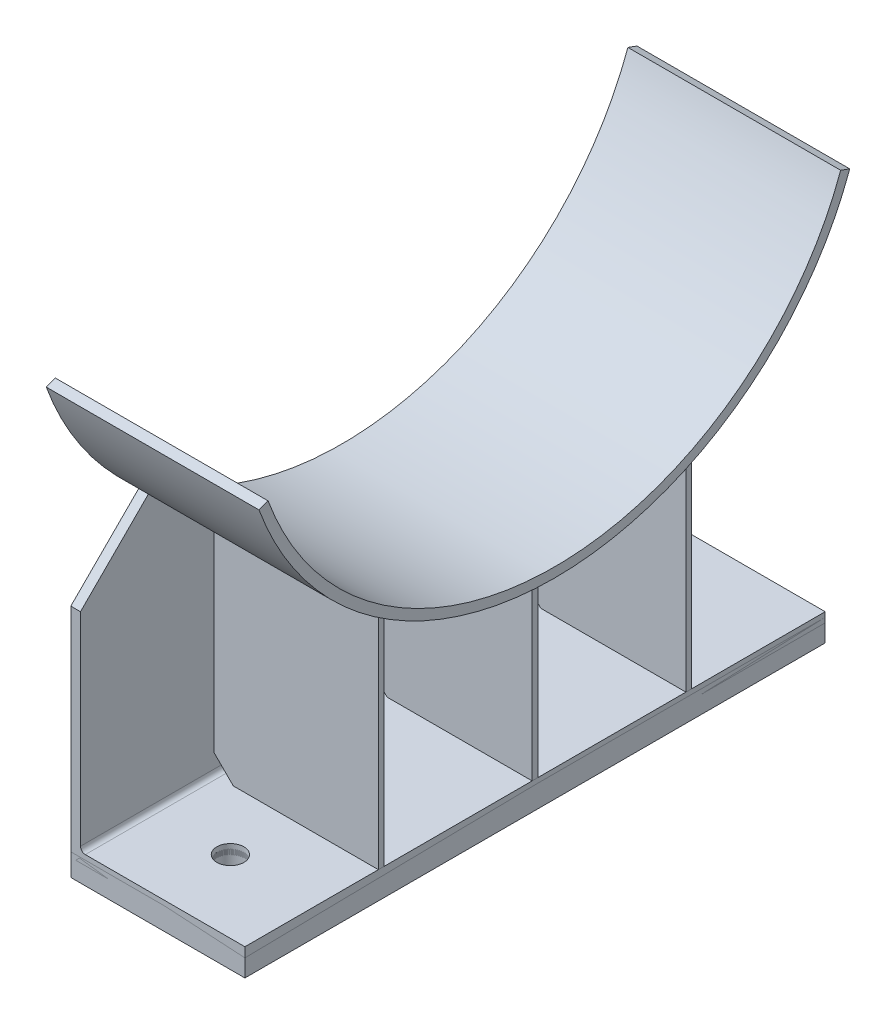
ISO-10303-21;
HEADER;
FILE_DESCRIPTION(('STEP AP214'),'2;1');
FILE_NAME('part.step','',(''),(''),'','','');
FILE_SCHEMA(('AUTOMOTIVE_DESIGN { 1 0 10303 214 1 1 1 1 }'));
ENDSEC;
DATA;
#1=APPLICATION_CONTEXT('core data for automotive mechanical design processes');
#2=APPLICATION_PROTOCOL_DEFINITION('international standard','automotive_design',2000,#1);
#3=PRODUCT_CONTEXT('',#1,'mechanical');
#4=PRODUCT('Part','Part','',(#3));
#5=PRODUCT_RELATED_PRODUCT_CATEGORY('part','',(#4));
#6=PRODUCT_DEFINITION_FORMATION('','',#4);
#7=PRODUCT_DEFINITION_CONTEXT('part definition',#1,'design');
#8=PRODUCT_DEFINITION('design','',#6,#7);
#9=PRODUCT_DEFINITION_SHAPE('','',#8);
#10=(LENGTH_UNIT() NAMED_UNIT(*) SI_UNIT(.MILLI.,.METRE.));
#11=(NAMED_UNIT(*) PLANE_ANGLE_UNIT() SI_UNIT($,.RADIAN.));
#12=(NAMED_UNIT(*) SI_UNIT($,.STERADIAN.) SOLID_ANGLE_UNIT());
#13=UNCERTAINTY_MEASURE_WITH_UNIT(LENGTH_MEASURE(1.E-05),#10,'distance_accuracy_value','');
#14=(GEOMETRIC_REPRESENTATION_CONTEXT(3) GLOBAL_UNCERTAINTY_ASSIGNED_CONTEXT((#13)) GLOBAL_UNIT_ASSIGNED_CONTEXT((#10,
#11,#12)) REPRESENTATION_CONTEXT('',''));
#15=CARTESIAN_POINT('',(0.,0.,0.));
#16=DIRECTION('',(0.,0.,1.));
#17=DIRECTION('',(1.,0.,0.));
#18=AXIS2_PLACEMENT_3D('',#15,#16,#17);
#19=CARTESIAN_POINT('',(-90.,4.99999999999999,300.));
#20=DIRECTION('',(-1.,0.,0.));
#21=DIRECTION('',(0.,-1.,0.));
#22=AXIS2_PLACEMENT_3D('',#19,#20,#21);
#23=PLANE('',#22);
#24=DIRECTION('',(0.,-1.,0.));
#25=VECTOR('',#24,1.);
#26=CARTESIAN_POINT('',(-90.,4.99999999999999,-300.));
#27=LINE('',#26,#25);
#28=CARTESIAN_POINT('',(-90.,4.99999999999999,-300.));
#29=VERTEX_POINT('',#28);
#30=CARTESIAN_POINT('',(-90.,-18.,-300.));
#31=VERTEX_POINT('',#30);
#32=EDGE_CURVE('P0_E35',#29,#31,#27,.T.);
#33=ORIENTED_EDGE('',*,*,#32,.T.);
#34=DIRECTION('',(0.,0.,-1.));
#35=VECTOR('',#34,1.);
#36=CARTESIAN_POINT('',(-90.,-18.,300.));
#37=LINE('',#36,#35);
#38=CARTESIAN_POINT('',(-90.,-18.,300.));
#39=VERTEX_POINT('',#38);
#40=EDGE_CURVE('P0_E72',#39,#31,#37,.T.);
#41=ORIENTED_EDGE('',*,*,#40,.F.);
#42=DIRECTION('',(0.,-1.,0.));
#43=VECTOR('',#42,1.);
#44=CARTESIAN_POINT('',(-90.,4.99999999999999,300.));
#45=LINE('',#44,#43);
#46=CARTESIAN_POINT('',(-90.,4.99999999999999,300.));
#47=VERTEX_POINT('',#46);
#48=EDGE_CURVE('P0_E11',#47,#39,#45,.T.);
#49=ORIENTED_EDGE('',*,*,#48,.F.);
#50=DIRECTION('',(0.,0.,-1.));
#51=VECTOR('',#50,1.);
#52=CARTESIAN_POINT('',(-90.,4.99999999999999,300.));
#53=LINE('',#52,#51);
#54=EDGE_CURVE('P0_E73',#47,#29,#53,.T.);
#55=ORIENTED_EDGE('',*,*,#54,.T.);
#56=EDGE_LOOP('',(#33,#41,#49,#55));
#57=FACE_BOUND('',#56,.T.);
#58=ADVANCED_FACE('P0_F32',(#57),#23,.T.);
#59=CARTESIAN_POINT('',(90.,5.00000000000001,300.));
#60=DIRECTION('',(0.,0.,1.));
#61=DIRECTION('',(1.,0.,0.));
#62=AXIS2_PLACEMENT_3D('',#59,#60,#61);
#63=PLANE('',#62);
#64=ORIENTED_EDGE('',*,*,#48,.T.);
#65=DIRECTION('',(-1.,0.,0.));
#66=VECTOR('',#65,1.);
#67=CARTESIAN_POINT('',(90.,-18.,300.));
#68=LINE('',#67,#66);
#69=CARTESIAN_POINT('',(90.,-18.,300.));
#70=VERTEX_POINT('',#69);
#71=EDGE_CURVE('P0_E89',#70,#39,#68,.T.);
#72=ORIENTED_EDGE('',*,*,#71,.F.);
#73=DIRECTION('',(0.,-1.,0.));
#74=VECTOR('',#73,1.);
#75=CARTESIAN_POINT('',(90.,5.00000000000001,300.));
#76=LINE('',#75,#74);
#77=CARTESIAN_POINT('',(90.,5.00000000000001,300.));
#78=VERTEX_POINT('',#77);
#79=EDGE_CURVE('P0_E40',#78,#70,#76,.T.);
#80=ORIENTED_EDGE('',*,*,#79,.F.);
#81=DIRECTION('',(-1.,0.,0.));
#82=VECTOR('',#81,1.);
#83=CARTESIAN_POINT('',(90.,5.00000000000001,300.));
#84=LINE('',#83,#82);
#85=EDGE_CURVE('P0_E78',#78,#47,#84,.T.);
#86=ORIENTED_EDGE('',*,*,#85,.T.);
#87=EDGE_LOOP('',(#64,#72,#80,#86));
#88=FACE_BOUND('',#87,.T.);
#89=ADVANCED_FACE('P0_F109',(#88),#63,.T.);
#90=CARTESIAN_POINT('',(90.,5.00000000000001,300.));
#91=DIRECTION('',(1.,0.,0.));
#92=DIRECTION('',(0.,1.,0.));
#93=AXIS2_PLACEMENT_3D('',#90,#91,#92);
#94=PLANE('',#93);
#95=ORIENTED_EDGE('',*,*,#79,.T.);
#96=DIRECTION('',(0.,0.,1.));
#97=VECTOR('',#96,1.);
#98=CARTESIAN_POINT('',(90.,-18.,300.));
#99=LINE('',#98,#97);
#100=CARTESIAN_POINT('',(90.,-18.,-300.));
#101=VERTEX_POINT('',#100);
#102=EDGE_CURVE('P0_E85',#101,#70,#99,.T.);
#103=ORIENTED_EDGE('',*,*,#102,.F.);
#104=DIRECTION('',(0.,-1.,0.));
#105=VECTOR('',#104,1.);
#106=CARTESIAN_POINT('',(90.,5.00000000000001,-300.));
#107=LINE('',#106,#105);
#108=CARTESIAN_POINT('',(90.,5.00000000000001,-300.));
#109=VERTEX_POINT('',#108);
#110=EDGE_CURVE('P0_E77',#109,#101,#107,.T.);
#111=ORIENTED_EDGE('',*,*,#110,.F.);
#112=DIRECTION('',(0.,0.,1.));
#113=VECTOR('',#112,1.);
#114=CARTESIAN_POINT('',(90.,5.00000000000001,300.));
#115=LINE('',#114,#113);
#116=EDGE_CURVE('P0_E102',#109,#78,#115,.T.);
#117=ORIENTED_EDGE('',*,*,#116,.T.);
#118=EDGE_LOOP('',(#95,#103,#111,#117));
#119=FACE_BOUND('',#118,.T.);
#120=ADVANCED_FACE('P0_F106',(#119),#94,.T.);
#121=CARTESIAN_POINT('',(90.,5.00000000000001,-300.));
#122=DIRECTION('',(0.,0.,-1.));
#123=DIRECTION('',(-1.,0.,0.));
#124=AXIS2_PLACEMENT_3D('',#121,#122,#123);
#125=PLANE('',#124);
#126=ORIENTED_EDGE('',*,*,#110,.T.);
#127=DIRECTION('',(1.,0.,0.));
#128=VECTOR('',#127,1.);
#129=CARTESIAN_POINT('',(90.,-18.,-300.));
#130=LINE('',#129,#128);
#131=EDGE_CURVE('P0_E80',#31,#101,#130,.T.);
#132=ORIENTED_EDGE('',*,*,#131,.F.);
#133=ORIENTED_EDGE('',*,*,#32,.F.);
#134=DIRECTION('',(1.,0.,0.));
#135=VECTOR('',#134,1.);
#136=CARTESIAN_POINT('',(90.,5.00000000000001,-300.));
#137=LINE('',#136,#135);
#138=EDGE_CURVE('P0_E100',#29,#109,#137,.T.);
#139=ORIENTED_EDGE('',*,*,#138,.T.);
#140=EDGE_LOOP('',(#126,#132,#133,#139));
#141=FACE_BOUND('',#140,.T.);
#142=ADVANCED_FACE('P0_F81',(#141),#125,.T.);
#143=CARTESIAN_POINT('',(0.,5.,0.));
#144=DIRECTION('',(0.,1.,0.));
#145=DIRECTION('',(-1.,0.,0.));
#146=AXIS2_PLACEMENT_3D('',#143,#144,#145);
#147=PLANE('',#146);
#148=CARTESIAN_POINT('',(0.,5.,225.));
#149=DIRECTION('',(0.,1.,0.));
#150=DIRECTION('',(-1.,0.,0.));
#151=AXIS2_PLACEMENT_3D('',#148,#149,#150);
#152=CIRCLE('',#151,14.);
#153=CARTESIAN_POINT('',(-14.,5.,225.));
#154=VERTEX_POINT('',#153);
#155=EDGE_CURVE('P0_E177',#154,#154,#152,.T.);
#156=ORIENTED_EDGE('',*,*,#155,.F.);
#157=EDGE_LOOP('',(#156));
#158=FACE_BOUND('',#157,.T.);
#159=CARTESIAN_POINT('',(0.,5.,-225.));
#160=DIRECTION('',(0.,1.,0.));
#161=DIRECTION('',(-1.,0.,0.));
#162=AXIS2_PLACEMENT_3D('',#159,#160,#161);
#163=CIRCLE('',#162,14.);
#164=CARTESIAN_POINT('',(-14.,5.,-225.));
#165=VERTEX_POINT('',#164);
#166=EDGE_CURVE('P0_E93',#165,#165,#163,.T.);
#167=ORIENTED_EDGE('',*,*,#166,.F.);
#168=EDGE_LOOP('',(#167));
#169=FACE_BOUND('',#168,.T.);
#170=ORIENTED_EDGE('',*,*,#54,.F.);
#171=ORIENTED_EDGE('',*,*,#85,.F.);
#172=ORIENTED_EDGE('',*,*,#116,.F.);
#173=ORIENTED_EDGE('',*,*,#138,.F.);
#174=EDGE_LOOP('',(#170,#171,#172,#173));
#175=FACE_BOUND('',#174,.T.);
#176=ADVANCED_FACE('P0_F111',(#158,#169,#175),#147,.T.);
#177=CARTESIAN_POINT('',(0.,-18.,0.));
#178=DIRECTION('',(0.,1.,0.));
#179=DIRECTION('',(-1.,0.,0.));
#180=AXIS2_PLACEMENT_3D('',#177,#178,#179);
#181=PLANE('',#180);
#182=CARTESIAN_POINT('',(0.,-18.,225.));
#183=DIRECTION('',(0.,1.,0.));
#184=DIRECTION('',(-1.,0.,0.));
#185=AXIS2_PLACEMENT_3D('',#182,#183,#184);
#186=CIRCLE('',#185,14.);
#187=CARTESIAN_POINT('',(-14.,-18.,225.));
#188=VERTEX_POINT('',#187);
#189=EDGE_CURVE('P0_E175',#188,#188,#186,.F.);
#190=ORIENTED_EDGE('',*,*,#189,.F.);
#191=EDGE_LOOP('',(#190));
#192=FACE_BOUND('',#191,.T.);
#193=CARTESIAN_POINT('',(0.,-18.,-225.));
#194=DIRECTION('',(0.,1.,0.));
#195=DIRECTION('',(-1.,0.,0.));
#196=AXIS2_PLACEMENT_3D('',#193,#194,#195);
#197=CIRCLE('',#196,14.);
#198=CARTESIAN_POINT('',(-14.,-18.,-225.));
#199=VERTEX_POINT('',#198);
#200=EDGE_CURVE('P0_E90',#199,#199,#197,.F.);
#201=ORIENTED_EDGE('',*,*,#200,.F.);
#202=EDGE_LOOP('',(#201));
#203=FACE_BOUND('',#202,.T.);
#204=ORIENTED_EDGE('',*,*,#40,.T.);
#205=ORIENTED_EDGE('',*,*,#131,.T.);
#206=ORIENTED_EDGE('',*,*,#102,.T.);
#207=ORIENTED_EDGE('',*,*,#71,.T.);
#208=EDGE_LOOP('',(#204,#205,#206,#207));
#209=FACE_BOUND('',#208,.T.);
#210=ADVANCED_FACE('P0_F88',(#192,#203,#209),#181,.F.);
#211=CARTESIAN_POINT('',(0.,-57.5979797464467,-225.));
#212=DIRECTION('',(0.,1.,0.));
#213=DIRECTION('',(-1.,0.,0.));
#214=AXIS2_PLACEMENT_3D('',#211,#212,#213);
#215=CYLINDRICAL_SURFACE('',#214,14.);
#216=ORIENTED_EDGE('',*,*,#200,.T.);
#217=EDGE_LOOP('',(#216));
#218=FACE_BOUND('',#217,.T.);
#219=ORIENTED_EDGE('',*,*,#166,.T.);
#220=EDGE_LOOP('',(#219));
#221=FACE_BOUND('',#220,.T.);
#222=ADVANCED_FACE('P0_F119',(#218,#221),#215,.F.);
#223=CARTESIAN_POINT('',(0.,-57.5979797464467,225.));
#224=DIRECTION('',(0.,1.,0.));
#225=DIRECTION('',(-1.,0.,0.));
#226=AXIS2_PLACEMENT_3D('',#223,#224,#225);
#227=CYLINDRICAL_SURFACE('',#226,14.);
#228=ORIENTED_EDGE('',*,*,#189,.T.);
#229=EDGE_LOOP('',(#228));
#230=FACE_BOUND('',#229,.T.);
#231=ORIENTED_EDGE('',*,*,#155,.T.);
#232=EDGE_LOOP('',(#231));
#233=FACE_BOUND('',#232,.T.);
#234=ADVANCED_FACE('P0_F158',(#230,#233),#227,.F.);
#235=CLOSED_SHELL('',(#58,#89,#120,#142,#176,#210,#222,#234));
#236=MANIFOLD_SOLID_BREP('P0_B2',#235);
#237=CARTESIAN_POINT('',(0.,0.,225.));
#238=DIRECTION('',(0.,1.,0.));
#239=DIRECTION('',(-1.,0.,0.));
#240=AXIS2_PLACEMENT_3D('',#237,#238,#239);
#241=CYLINDRICAL_SURFACE('',#240,14.);
#242=CARTESIAN_POINT('',(0.,0.,225.));
#243=DIRECTION('',(0.,1.,0.));
#244=DIRECTION('',(1.,0.,0.));
#245=AXIS2_PLACEMENT_3D('',#242,#243,#244);
#246=CIRCLE('',#245,14.);
#247=CARTESIAN_POINT('',(14.,0.,225.));
#248=VERTEX_POINT('',#247);
#249=EDGE_CURVE('P1_E333',#248,#248,#246,.T.);
#250=ORIENTED_EDGE('',*,*,#249,.F.);
#251=EDGE_LOOP('',(#250));
#252=FACE_BOUND('',#251,.T.);
#253=CARTESIAN_POINT('',(0.,10.,225.));
#254=DIRECTION('',(0.,1.,0.));
#255=DIRECTION('',(1.,0.,0.));
#256=AXIS2_PLACEMENT_3D('',#253,#254,#255);
#257=CIRCLE('',#256,14.);
#258=CARTESIAN_POINT('',(14.,10.,225.));
#259=VERTEX_POINT('',#258);
#260=EDGE_CURVE('P1_E336',#259,#259,#257,.T.);
#261=ORIENTED_EDGE('',*,*,#260,.T.);
#262=EDGE_LOOP('',(#261));
#263=FACE_BOUND('',#262,.T.);
#264=ADVANCED_FACE('P1_F16',(#252,#263),#241,.F.);
#265=CARTESIAN_POINT('',(90.,0.,300.));
#266=DIRECTION('',(0.,1.,0.));
#267=DIRECTION('',(-1.,0.,0.));
#268=AXIS2_PLACEMENT_3D('',#265,#266,#267);
#269=PLANE('',#268);
#270=ORIENTED_EDGE('',*,*,#249,.T.);
#271=EDGE_LOOP('',(#270));
#272=FACE_BOUND('',#271,.T.);
#273=CARTESIAN_POINT('',(0.,0.,-225.));
#274=DIRECTION('',(0.,1.,0.));
#275=DIRECTION('',(-1.,0.,0.));
#276=AXIS2_PLACEMENT_3D('',#273,#274,#275);
#277=CIRCLE('',#276,14.);
#278=CARTESIAN_POINT('',(-14.,0.,-225.));
#279=VERTEX_POINT('',#278);
#280=EDGE_CURVE('P1_E104',#279,#279,#277,.T.);
#281=ORIENTED_EDGE('',*,*,#280,.T.);
#282=EDGE_LOOP('',(#281));
#283=FACE_BOUND('',#282,.T.);
#284=DIRECTION('',(1.,0.,0.));
#285=VECTOR('',#284,1.);
#286=CARTESIAN_POINT('',(90.,0.,-300.));
#287=LINE('',#286,#285);
#288=CARTESIAN_POINT('',(-85.,0.,-300.));
#289=VERTEX_POINT('',#288);
#290=CARTESIAN_POINT('',(90.,0.,-300.));
#291=VERTEX_POINT('',#290);
#292=EDGE_CURVE('P1_E94',#289,#291,#287,.T.);
#293=ORIENTED_EDGE('',*,*,#292,.T.);
#294=DIRECTION('',(0.,0.,-1.));
#295=VECTOR('',#294,1.);
#296=CARTESIAN_POINT('',(90.,0.,300.));
#297=LINE('',#296,#295);
#298=CARTESIAN_POINT('',(90.,0.,300.));
#299=VERTEX_POINT('',#298);
#300=EDGE_CURVE('P1_E97',#299,#291,#297,.T.);
#301=ORIENTED_EDGE('',*,*,#300,.F.);
#302=DIRECTION('',(1.,0.,0.));
#303=VECTOR('',#302,1.);
#304=CARTESIAN_POINT('',(90.,0.,300.));
#305=LINE('',#304,#303);
#306=CARTESIAN_POINT('',(-85.,0.,300.));
#307=VERTEX_POINT('',#306);
#308=EDGE_CURVE('P1_E113',#307,#299,#305,.T.);
#309=ORIENTED_EDGE('',*,*,#308,.F.);
#310=DIRECTION('',(0.,0.,-1.));
#311=VECTOR('',#310,1.);
#312=CARTESIAN_POINT('',(-85.,0.,300.));
#313=LINE('',#312,#311);
#314=EDGE_CURVE('P1_E100',#307,#289,#313,.T.);
#315=ORIENTED_EDGE('',*,*,#314,.T.);
#316=EDGE_LOOP('',(#293,#301,#309,#315));
#317=FACE_BOUND('',#316,.T.);
#318=ADVANCED_FACE('P1_F96',(#272,#283,#317),#269,.F.);
#319=CARTESIAN_POINT('',(0.,0.,-225.));
#320=DIRECTION('',(0.,1.,0.));
#321=DIRECTION('',(-1.,0.,0.));
#322=AXIS2_PLACEMENT_3D('',#319,#320,#321);
#323=CYLINDRICAL_SURFACE('',#322,14.);
#324=ORIENTED_EDGE('',*,*,#280,.F.);
#325=EDGE_LOOP('',(#324));
#326=FACE_BOUND('',#325,.T.);
#327=CARTESIAN_POINT('',(0.,10.,-225.));
#328=DIRECTION('',(0.,1.,0.));
#329=DIRECTION('',(-1.,0.,0.));
#330=AXIS2_PLACEMENT_3D('',#327,#328,#329);
#331=CIRCLE('',#330,14.);
#332=CARTESIAN_POINT('',(-14.,10.,-225.));
#333=VERTEX_POINT('',#332);
#334=EDGE_CURVE('P1_E344',#333,#333,#331,.T.);
#335=ORIENTED_EDGE('',*,*,#334,.T.);
#336=EDGE_LOOP('',(#335));
#337=FACE_BOUND('',#336,.T.);
#338=ADVANCED_FACE('P1_F278',(#326,#337),#323,.F.);
#339=CARTESIAN_POINT('',(90.,10.,300.));
#340=DIRECTION('',(0.,-1.,0.));
#341=DIRECTION('',(1.,0.,0.));
#342=AXIS2_PLACEMENT_3D('',#339,#340,#341);
#343=PLANE('',#342);
#344=ORIENTED_EDGE('',*,*,#260,.F.);
#345=EDGE_LOOP('',(#344));
#346=FACE_BOUND('',#345,.T.);
#347=ORIENTED_EDGE('',*,*,#334,.F.);
#348=EDGE_LOOP('',(#347));
#349=FACE_BOUND('',#348,.T.);
#350=DIRECTION('',(-1.,0.,0.));
#351=VECTOR('',#350,1.);
#352=CARTESIAN_POINT('',(90.,10.,-300.));
#353=LINE('',#352,#351);
#354=CARTESIAN_POINT('',(90.,10.,-300.));
#355=VERTEX_POINT('',#354);
#356=CARTESIAN_POINT('',(-75.,10.,-300.));
#357=VERTEX_POINT('',#356);
#358=EDGE_CURVE('P1_E117',#355,#357,#353,.T.);
#359=ORIENTED_EDGE('',*,*,#358,.T.);
#360=DIRECTION('',(0.,0.,-1.));
#361=VECTOR('',#360,1.);
#362=CARTESIAN_POINT('',(-75.,10.,300.));
#363=LINE('',#362,#361);
#364=CARTESIAN_POINT('',(-75.,10.,300.));
#365=VERTEX_POINT('',#364);
#366=EDGE_CURVE('P1_E348',#365,#357,#363,.T.);
#367=ORIENTED_EDGE('',*,*,#366,.F.);
#368=DIRECTION('',(-1.,0.,0.));
#369=VECTOR('',#368,1.);
#370=CARTESIAN_POINT('',(90.,10.,300.));
#371=LINE('',#370,#369);
#372=CARTESIAN_POINT('',(90.,10.,300.));
#373=VERTEX_POINT('',#372);
#374=EDGE_CURVE('P1_E167',#373,#365,#371,.T.);
#375=ORIENTED_EDGE('',*,*,#374,.F.);
#376=DIRECTION('',(0.,0.,-1.));
#377=VECTOR('',#376,1.);
#378=CARTESIAN_POINT('',(90.,10.,300.));
#379=LINE('',#378,#377);
#380=EDGE_CURVE('P1_E351',#373,#355,#379,.T.);
#381=ORIENTED_EDGE('',*,*,#380,.T.);
#382=EDGE_LOOP('',(#359,#367,#375,#381));
#383=FACE_BOUND('',#382,.T.);
#384=ADVANCED_FACE('P1_F271',(#346,#349,#383),#343,.F.);
#385=CARTESIAN_POINT('',(-75.,15.,-300.));
#386=DIRECTION('',(0.,0.,-1.));
#387=DIRECTION('',(-1.,0.,0.));
#388=AXIS2_PLACEMENT_3D('',#385,#386,#387);
#389=PLANE('',#388);
#390=DIRECTION('',(-1.,0.,0.));
#391=VECTOR('',#390,1.);
#392=CARTESIAN_POINT('',(-75.,224.999999999997,-300.));
#393=LINE('',#392,#391);
#394=CARTESIAN_POINT('',(-80.,224.999999999997,-300.));
#395=VERTEX_POINT('',#394);
#396=CARTESIAN_POINT('',(-90.,224.999999999997,-300.));
#397=VERTEX_POINT('',#396);
#398=EDGE_CURVE('P1_E175',#395,#397,#393,.T.);
#399=ORIENTED_EDGE('',*,*,#398,.F.);
#400=DIRECTION('',(0.,1.,0.));
#401=VECTOR('',#400,1.);
#402=CARTESIAN_POINT('',(-80.,15.,-300.));
#403=LINE('',#402,#401);
#404=CARTESIAN_POINT('',(-80.,15.,-300.));
#405=VERTEX_POINT('',#404);
#406=EDGE_CURVE('P1_E125',#405,#395,#403,.T.);
#407=ORIENTED_EDGE('',*,*,#406,.F.);
#408=CARTESIAN_POINT('',(-75.,15.,-300.));
#409=DIRECTION('',(0.,0.,-1.));
#410=DIRECTION('',(-1.,0.,0.));
#411=AXIS2_PLACEMENT_3D('',#408,#409,#410);
#412=CIRCLE('',#411,5.);
#413=EDGE_CURVE('P1_E120',#357,#405,#412,.T.);
#414=ORIENTED_EDGE('',*,*,#413,.F.);
#415=ORIENTED_EDGE('',*,*,#358,.F.);
#416=DIRECTION('',(0.,1.,0.));
#417=VECTOR('',#416,1.);
#418=CARTESIAN_POINT('',(90.,0.,-300.));
#419=LINE('',#418,#417);
#420=EDGE_CURVE('P1_E110',#291,#355,#419,.T.);
#421=ORIENTED_EDGE('',*,*,#420,.F.);
#422=ORIENTED_EDGE('',*,*,#292,.F.);
#423=CARTESIAN_POINT('',(-85.,5.00000000000001,-300.));
#424=DIRECTION('',(0.,0.,1.));
#425=DIRECTION('',(-1.,0.,0.));
#426=AXIS2_PLACEMENT_3D('',#423,#424,#425);
#427=CIRCLE('',#426,5.);
#428=CARTESIAN_POINT('',(-90.,5.00000000000001,-300.));
#429=VERTEX_POINT('',#428);
#430=EDGE_CURVE('P1_E119',#429,#289,#427,.T.);
#431=ORIENTED_EDGE('',*,*,#430,.F.);
#432=DIRECTION('',(0.,-1.,0.));
#433=VECTOR('',#432,1.);
#434=CARTESIAN_POINT('',(-90.,5.00000000000001,-300.));
#435=LINE('',#434,#433);
#436=EDGE_CURVE('P1_E122',#397,#429,#435,.T.);
#437=ORIENTED_EDGE('',*,*,#436,.F.);
#438=EDGE_LOOP('',(#399,#407,#414,#415,#421,#422,#431,#437));
#439=FACE_BOUND('',#438,.T.);
#440=ADVANCED_FACE('P1_F115',(#439),#389,.T.);
#441=CARTESIAN_POINT('',(90.,295.190296114371,-229.809703885627));
#442=DIRECTION('',(0.,-0.707106781186543,0.707106781186551));
#443=DIRECTION('',(0.,-0.707106781186552,-0.707106781186544));
#444=AXIS2_PLACEMENT_3D('',#441,#442,#443);
#445=PLANE('',#444);
#446=ORIENTED_EDGE('',*,*,#398,.T.);
#447=DIRECTION('',(0.,0.707106781186551,0.707106781186544));
#448=VECTOR('',#447,1.);
#449=CARTESIAN_POINT('',(-90.,295.190296114371,-229.809703885627));
#450=LINE('',#449,#448);
#451=CARTESIAN_POINT('',(-90.,295.190296114371,-229.809703885627));
#452=VERTEX_POINT('',#451);
#453=EDGE_CURVE('P1_E131',#397,#452,#450,.T.);
#454=ORIENTED_EDGE('',*,*,#453,.T.);
#455=DIRECTION('',(-1.,0.,0.));
#456=VECTOR('',#455,1.);
#457=CARTESIAN_POINT('',(90.,295.190296114371,-229.809703885627));
#458=LINE('',#457,#456);
#459=CARTESIAN_POINT('',(-79.9999999999999,295.190296114371,-229.809703885627));
#460=VERTEX_POINT('',#459);
#461=EDGE_CURVE('P1_E133',#460,#452,#458,.T.);
#462=ORIENTED_EDGE('',*,*,#461,.F.);
#463=DIRECTION('',(0.,0.707106781186552,0.707106781186544));
#464=VECTOR('',#463,1.);
#465=CARTESIAN_POINT('',(-80.,419.999999999997,-105.000000000002));
#466=LINE('',#465,#464);
#467=EDGE_CURVE('P1_E136',#395,#460,#466,.T.);
#468=ORIENTED_EDGE('',*,*,#467,.F.);
#469=EDGE_LOOP('',(#446,#454,#462,#468));
#470=FACE_BOUND('',#469,.T.);
#471=ADVANCED_FACE('P1_F177',(#470),#445,.F.);
#472=CARTESIAN_POINT('',(-90.,5.00000000000001,300.));
#473=DIRECTION('',(1.,0.,0.));
#474=DIRECTION('',(0.,0.,-1.));
#475=AXIS2_PLACEMENT_3D('',#472,#473,#474);
#476=PLANE('',#475);
#477=CARTESIAN_POINT('',(-90.,525.,0.));
#478=DIRECTION('',(-1.,0.,0.));
#479=DIRECTION('',(0.,0.,1.));
#480=AXIS2_PLACEMENT_3D('',#477,#478,#479);
#481=CIRCLE('',#480,325.);
#482=CARTESIAN_POINT('',(-90.,295.190296114371,229.809703885627));
#483=VERTEX_POINT('',#482);
#484=EDGE_CURVE('P1_E139',#452,#483,#481,.T.);
#485=ORIENTED_EDGE('',*,*,#484,.F.);
#486=ORIENTED_EDGE('',*,*,#453,.F.);
#487=ORIENTED_EDGE('',*,*,#436,.T.);
#488=DIRECTION('',(0.,0.,-1.));
#489=VECTOR('',#488,1.);
#490=CARTESIAN_POINT('',(-90.,5.00000000000001,300.));
#491=LINE('',#490,#489);
#492=CARTESIAN_POINT('',(-90.,5.00000000000001,300.));
#493=VERTEX_POINT('',#492);
#494=EDGE_CURVE('P1_E141',#493,#429,#491,.T.);
#495=ORIENTED_EDGE('',*,*,#494,.F.);
#496=DIRECTION('',(0.,-1.,0.));
#497=VECTOR('',#496,1.);
#498=CARTESIAN_POINT('',(-90.,5.00000000000001,300.));
#499=LINE('',#498,#497);
#500=CARTESIAN_POINT('',(-90.,224.999999999997,300.));
#501=VERTEX_POINT('',#500);
#502=EDGE_CURVE('P1_E144',#501,#493,#499,.T.);
#503=ORIENTED_EDGE('',*,*,#502,.F.);
#504=DIRECTION('',(0.,-0.707106781186551,0.707106781186544));
#505=VECTOR('',#504,1.);
#506=CARTESIAN_POINT('',(-90.,295.190296114371,229.809703885627));
#507=LINE('',#506,#505);
#508=EDGE_CURVE('P1_E147',#483,#501,#507,.T.);
#509=ORIENTED_EDGE('',*,*,#508,.F.);
#510=EDGE_LOOP('',(#485,#486,#487,#495,#503,#509));
#511=FACE_BOUND('',#510,.T.);
#512=ADVANCED_FACE('P1_F185',(#511),#476,.F.);
#513=CARTESIAN_POINT('',(90.,525.,0.));
#514=DIRECTION('',(-1.,0.,0.));
#515=DIRECTION('',(0.,0.,1.));
#516=AXIS2_PLACEMENT_3D('',#513,#514,#515);
#517=CYLINDRICAL_SURFACE('',#516,325.);
#518=ORIENTED_EDGE('',*,*,#461,.T.);
#519=ORIENTED_EDGE('',*,*,#484,.T.);
#520=DIRECTION('',(-1.,0.,0.));
#521=VECTOR('',#520,1.);
#522=CARTESIAN_POINT('',(90.,295.190296114371,229.809703885627));
#523=LINE('',#522,#521);
#524=CARTESIAN_POINT('',(-79.9999999999999,295.190296114371,229.809703885627));
#525=VERTEX_POINT('',#524);
#526=EDGE_CURVE('P1_E149',#525,#483,#523,.T.);
#527=ORIENTED_EDGE('',*,*,#526,.F.);
#528=CARTESIAN_POINT('',(-80.,525.,0.));
#529=DIRECTION('',(-1.,0.,0.));
#530=DIRECTION('',(0.,-1.,0.));
#531=AXIS2_PLACEMENT_3D('',#528,#529,#530);
#532=CIRCLE('',#531,325.);
#533=EDGE_CURVE('P1_E152',#460,#525,#532,.T.);
#534=ORIENTED_EDGE('',*,*,#533,.F.);
#535=EDGE_LOOP('',(#518,#519,#527,#534));
#536=FACE_BOUND('',#535,.T.);
#537=ADVANCED_FACE('P1_F182',(#536),#517,.F.);
#538=CARTESIAN_POINT('',(90.,295.190296114371,229.809703885627));
#539=DIRECTION('',(0.,-0.707106781186544,-0.707106781186551));
#540=DIRECTION('',(0.,0.707106781186551,-0.707106781186544));
#541=AXIS2_PLACEMENT_3D('',#538,#539,#540);
#542=PLANE('',#541);
#543=ORIENTED_EDGE('',*,*,#526,.T.);
#544=ORIENTED_EDGE('',*,*,#508,.T.);
#545=DIRECTION('',(-1.,0.,0.));
#546=VECTOR('',#545,1.);
#547=CARTESIAN_POINT('',(-75.,224.999999999997,300.));
#548=LINE('',#547,#546);
#549=CARTESIAN_POINT('',(-79.9999999999999,224.999999999997,300.));
#550=VERTEX_POINT('',#549);
#551=EDGE_CURVE('P1_E38',#550,#501,#548,.T.);
#552=ORIENTED_EDGE('',*,*,#551,.F.);
#553=DIRECTION('',(0.,-0.707106781186551,0.707106781186544));
#554=VECTOR('',#553,1.);
#555=CARTESIAN_POINT('',(-80.,119.999999999997,404.999999999998));
#556=LINE('',#555,#554);
#557=EDGE_CURVE('P1_E156',#525,#550,#556,.T.);
#558=ORIENTED_EDGE('',*,*,#557,.F.);
#559=EDGE_LOOP('',(#543,#544,#552,#558));
#560=FACE_BOUND('',#559,.T.);
#561=ADVANCED_FACE('P1_F186',(#560),#542,.F.);
#562=CARTESIAN_POINT('',(-75.,15.,300.));
#563=DIRECTION('',(0.,0.,-1.));
#564=DIRECTION('',(-1.,0.,0.));
#565=AXIS2_PLACEMENT_3D('',#562,#563,#564);
#566=PLANE('',#565);
#567=DIRECTION('',(0.,1.,0.));
#568=VECTOR('',#567,1.);
#569=CARTESIAN_POINT('',(-80.,15.,300.));
#570=LINE('',#569,#568);
#571=CARTESIAN_POINT('',(-80.,15.,300.));
#572=VERTEX_POINT('',#571);
#573=EDGE_CURVE('P1_E30',#572,#550,#570,.T.);
#574=ORIENTED_EDGE('',*,*,#573,.T.);
#575=ORIENTED_EDGE('',*,*,#551,.T.);
#576=ORIENTED_EDGE('',*,*,#502,.T.);
#577=CARTESIAN_POINT('',(-85.,5.00000000000001,300.));
#578=DIRECTION('',(0.,0.,1.));
#579=DIRECTION('',(-1.,0.,0.));
#580=AXIS2_PLACEMENT_3D('',#577,#578,#579);
#581=CIRCLE('',#580,5.);
#582=EDGE_CURVE('P1_E159',#493,#307,#581,.T.);
#583=ORIENTED_EDGE('',*,*,#582,.T.);
#584=ORIENTED_EDGE('',*,*,#308,.T.);
#585=DIRECTION('',(0.,1.,0.));
#586=VECTOR('',#585,1.);
#587=CARTESIAN_POINT('',(90.,0.,300.));
#588=LINE('',#587,#586);
#589=EDGE_CURVE('P1_E112',#299,#373,#588,.T.);
#590=ORIENTED_EDGE('',*,*,#589,.T.);
#591=ORIENTED_EDGE('',*,*,#374,.T.);
#592=CARTESIAN_POINT('',(-75.,15.,300.));
#593=DIRECTION('',(0.,0.,-1.));
#594=DIRECTION('',(-1.,0.,0.));
#595=AXIS2_PLACEMENT_3D('',#592,#593,#594);
#596=CIRCLE('',#595,5.);
#597=EDGE_CURVE('P1_E24',#365,#572,#596,.T.);
#598=ORIENTED_EDGE('',*,*,#597,.T.);
#599=EDGE_LOOP('',(#574,#575,#576,#583,#584,#590,#591,#598));
#600=FACE_BOUND('',#599,.T.);
#601=ADVANCED_FACE('P1_F166',(#600),#566,.F.);
#602=CARTESIAN_POINT('',(-80.,15.,300.));
#603=DIRECTION('',(-1.,0.,0.));
#604=DIRECTION('',(0.,-1.,0.));
#605=AXIS2_PLACEMENT_3D('',#602,#603,#604);
#606=PLANE('',#605);
#607=ORIENTED_EDGE('',*,*,#406,.T.);
#608=ORIENTED_EDGE('',*,*,#467,.T.);
#609=ORIENTED_EDGE('',*,*,#533,.T.);
#610=ORIENTED_EDGE('',*,*,#557,.T.);
#611=ORIENTED_EDGE('',*,*,#573,.F.);
#612=DIRECTION('',(0.,0.,-1.));
#613=VECTOR('',#612,1.);
#614=CARTESIAN_POINT('',(-80.,15.,300.));
#615=LINE('',#614,#613);
#616=EDGE_CURVE('P1_E11',#572,#405,#615,.T.);
#617=ORIENTED_EDGE('',*,*,#616,.T.);
#618=EDGE_LOOP('',(#607,#608,#609,#610,#611,#617));
#619=FACE_BOUND('',#618,.T.);
#620=ADVANCED_FACE('P1_F172',(#619),#606,.F.);
#621=CARTESIAN_POINT('',(-75.,15.,300.));
#622=DIRECTION('',(0.,0.,-1.));
#623=DIRECTION('',(-1.,0.,0.));
#624=AXIS2_PLACEMENT_3D('',#621,#622,#623);
#625=CYLINDRICAL_SURFACE('',#624,5.);
#626=ORIENTED_EDGE('',*,*,#413,.T.);
#627=ORIENTED_EDGE('',*,*,#616,.F.);
#628=ORIENTED_EDGE('',*,*,#597,.F.);
#629=ORIENTED_EDGE('',*,*,#366,.T.);
#630=EDGE_LOOP('',(#626,#627,#628,#629));
#631=FACE_BOUND('',#630,.T.);
#632=ADVANCED_FACE('P1_F170',(#631),#625,.F.);
#633=CARTESIAN_POINT('',(-85.,5.00000000000001,300.));
#634=DIRECTION('',(0.,0.,-1.));
#635=DIRECTION('',(-1.,0.,0.));
#636=AXIS2_PLACEMENT_3D('',#633,#634,#635);
#637=CYLINDRICAL_SURFACE('',#636,5.);
#638=ORIENTED_EDGE('',*,*,#430,.T.);
#639=ORIENTED_EDGE('',*,*,#314,.F.);
#640=ORIENTED_EDGE('',*,*,#582,.F.);
#641=ORIENTED_EDGE('',*,*,#494,.T.);
#642=EDGE_LOOP('',(#638,#639,#640,#641));
#643=FACE_BOUND('',#642,.T.);
#644=ADVANCED_FACE('P1_F197',(#643),#637,.T.);
#645=CARTESIAN_POINT('',(90.,0.,300.));
#646=DIRECTION('',(-1.,0.,0.));
#647=DIRECTION('',(0.,0.,1.));
#648=AXIS2_PLACEMENT_3D('',#645,#646,#647);
#649=PLANE('',#648);
#650=ORIENTED_EDGE('',*,*,#420,.T.);
#651=ORIENTED_EDGE('',*,*,#380,.F.);
#652=ORIENTED_EDGE('',*,*,#589,.F.);
#653=ORIENTED_EDGE('',*,*,#300,.T.);
#654=EDGE_LOOP('',(#650,#651,#652,#653));
#655=FACE_BOUND('',#654,.T.);
#656=ADVANCED_FACE('P1_F18',(#655),#649,.F.);
#657=OPEN_SHELL('',(#264,#318,#338,#384,#440,#471,#512,#537,#561,#601,#620,#632,#644,#656));
#658=SHELL_BASED_SURFACE_MODEL('P1_B1',(#657));
#659=CARTESIAN_POINT('',(-110.,525.,0.));
#660=DIRECTION('',(1.,0.,0.));
#661=DIRECTION('',(0.,0.,-1.));
#662=AXIS2_PLACEMENT_3D('',#659,#660,#661);
#663=CYLINDRICAL_SURFACE('',#662,315.);
#664=CARTESIAN_POINT('',(110.,525.,0.));
#665=DIRECTION('',(1.,0.,0.));
#666=DIRECTION('',(0.,0.,1.));
#667=AXIS2_PLACEMENT_3D('',#664,#665,#666);
#668=CIRCLE('',#667,315.);
#669=CARTESIAN_POINT('',(110.,417.263654852415,296.003175547561));
#670=VERTEX_POINT('',#669);
#671=CARTESIAN_POINT('',(110.,417.263654852415,-296.003175547562));
#672=VERTEX_POINT('',#671);
#673=EDGE_CURVE('P2_E55',#670,#672,#668,.T.);
#674=ORIENTED_EDGE('',*,*,#673,.T.);
#675=DIRECTION('',(1.,0.,0.));
#676=VECTOR('',#675,1.);
#677=CARTESIAN_POINT('',(-110.,417.263654852415,-296.003175547562));
#678=LINE('',#677,#676);
#679=CARTESIAN_POINT('',(-110.,417.263654852415,-296.003175547562));
#680=VERTEX_POINT('',#679);
#681=EDGE_CURVE('P2_E57',#680,#672,#678,.T.);
#682=ORIENTED_EDGE('',*,*,#681,.F.);
#683=CARTESIAN_POINT('',(-110.,525.,0.));
#684=DIRECTION('',(1.,0.,0.));
#685=DIRECTION('',(0.,0.,1.));
#686=AXIS2_PLACEMENT_3D('',#683,#684,#685);
#687=CIRCLE('',#686,315.);
#688=CARTESIAN_POINT('',(-110.,417.263654852415,296.003175547561));
#689=VERTEX_POINT('',#688);
#690=EDGE_CURVE('P2_E70',#689,#680,#687,.T.);
#691=ORIENTED_EDGE('',*,*,#690,.F.);
#692=DIRECTION('',(1.,0.,0.));
#693=VECTOR('',#692,1.);
#694=CARTESIAN_POINT('',(-110.,417.263654852415,296.003175547561));
#695=LINE('',#694,#693);
#696=EDGE_CURVE('P2_E60',#689,#670,#695,.T.);
#697=ORIENTED_EDGE('',*,*,#696,.T.);
#698=EDGE_LOOP('',(#674,#682,#691,#697));
#699=FACE_BOUND('',#698,.T.);
#700=ADVANCED_FACE('P2_F16',(#699),#663,.F.);
#701=CARTESIAN_POINT('',(110.,525.,0.));
#702=DIRECTION('',(-1.,0.,0.));
#703=DIRECTION('',(0.,0.,1.));
#704=AXIS2_PLACEMENT_3D('',#701,#702,#703);
#705=PLANE('',#704);
#706=CARTESIAN_POINT('',(110.,525.,0.));
#707=DIRECTION('',(-1.,0.,0.));
#708=DIRECTION('',(0.,0.,1.));
#709=AXIS2_PLACEMENT_3D('',#706,#707,#708);
#710=CIRCLE('',#709,325.);
#711=CARTESIAN_POINT('',(110.,413.843453419159,-305.400101755421));
#712=VERTEX_POINT('',#711);
#713=CARTESIAN_POINT('',(110.,413.843453419159,305.400101755421));
#714=VERTEX_POINT('',#713);
#715=EDGE_CURVE('P2_E73',#712,#714,#710,.T.);
#716=ORIENTED_EDGE('',*,*,#715,.F.);
#717=DIRECTION('',(0.,-0.342020143325679,-0.939692620785905));
#718=VECTOR('',#717,1.);
#719=CARTESIAN_POINT('',(110.,413.843453419159,-305.400101755421));
#720=LINE('',#719,#718);
#721=EDGE_CURVE('P2_E69',#672,#712,#720,.T.);
#722=ORIENTED_EDGE('',*,*,#721,.F.);
#723=ORIENTED_EDGE('',*,*,#673,.F.);
#724=DIRECTION('',(0.,0.342020143325649,-0.939692620785915));
#725=VECTOR('',#724,1.);
#726=CARTESIAN_POINT('',(110.,413.843453419159,305.400101755421));
#727=LINE('',#726,#725);
#728=EDGE_CURVE('P2_E74',#714,#670,#727,.T.);
#729=ORIENTED_EDGE('',*,*,#728,.F.);
#730=EDGE_LOOP('',(#716,#722,#723,#729));
#731=FACE_BOUND('',#730,.T.);
#732=ADVANCED_FACE('P2_F72',(#731),#705,.F.);
#733=CARTESIAN_POINT('',(-110.,525.,0.));
#734=DIRECTION('',(1.,0.,0.));
#735=DIRECTION('',(0.,0.,-1.));
#736=AXIS2_PLACEMENT_3D('',#733,#734,#735);
#737=CYLINDRICAL_SURFACE('',#736,325.);
#738=ORIENTED_EDGE('',*,*,#715,.T.);
#739=DIRECTION('',(1.,0.,0.));
#740=VECTOR('',#739,1.);
#741=CARTESIAN_POINT('',(-110.,413.843453419159,305.400101755421));
#742=LINE('',#741,#740);
#743=CARTESIAN_POINT('',(-110.,413.843453419159,305.400101755421));
#744=VERTEX_POINT('',#743);
#745=EDGE_CURVE('P2_E36',#744,#714,#742,.T.);
#746=ORIENTED_EDGE('',*,*,#745,.F.);
#747=CARTESIAN_POINT('',(-110.,525.,0.));
#748=DIRECTION('',(-1.,0.,0.));
#749=DIRECTION('',(0.,0.,1.));
#750=AXIS2_PLACEMENT_3D('',#747,#748,#749);
#751=CIRCLE('',#750,325.);
#752=CARTESIAN_POINT('',(-110.,413.843453419159,-305.400101755421));
#753=VERTEX_POINT('',#752);
#754=EDGE_CURVE('P2_E31',#753,#744,#751,.T.);
#755=ORIENTED_EDGE('',*,*,#754,.F.);
#756=DIRECTION('',(1.,0.,0.));
#757=VECTOR('',#756,1.);
#758=CARTESIAN_POINT('',(-110.,413.843453419159,-305.400101755421));
#759=LINE('',#758,#757);
#760=EDGE_CURVE('P2_E82',#753,#712,#759,.T.);
#761=ORIENTED_EDGE('',*,*,#760,.T.);
#762=EDGE_LOOP('',(#738,#746,#755,#761));
#763=FACE_BOUND('',#762,.T.);
#764=ADVANCED_FACE('P2_F91',(#763),#737,.T.);
#765=CARTESIAN_POINT('',(-110.,413.843453419159,305.400101755421));
#766=DIRECTION('',(0.,-0.939692620785916,-0.342020143325649));
#767=DIRECTION('',(0.,-0.342020143325649,0.939692620785916));
#768=AXIS2_PLACEMENT_3D('',#765,#766,#767);
#769=PLANE('',#768);
#770=ORIENTED_EDGE('',*,*,#728,.T.);
#771=ORIENTED_EDGE('',*,*,#696,.F.);
#772=DIRECTION('',(0.,0.342020143325649,-0.939692620785915));
#773=VECTOR('',#772,1.);
#774=CARTESIAN_POINT('',(-110.,413.843453419159,305.400101755421));
#775=LINE('',#774,#773);
#776=EDGE_CURVE('P2_E24',#744,#689,#775,.T.);
#777=ORIENTED_EDGE('',*,*,#776,.F.);
#778=ORIENTED_EDGE('',*,*,#745,.T.);
#779=EDGE_LOOP('',(#770,#771,#777,#778));
#780=FACE_BOUND('',#779,.T.);
#781=ADVANCED_FACE('P2_F88',(#780),#769,.F.);
#782=CARTESIAN_POINT('',(-110.,525.,0.));
#783=DIRECTION('',(-1.,0.,0.));
#784=DIRECTION('',(0.,0.,1.));
#785=AXIS2_PLACEMENT_3D('',#782,#783,#784);
#786=PLANE('',#785);
#787=ORIENTED_EDGE('',*,*,#754,.T.);
#788=ORIENTED_EDGE('',*,*,#776,.T.);
#789=ORIENTED_EDGE('',*,*,#690,.T.);
#790=DIRECTION('',(0.,-0.342020143325679,-0.939692620785905));
#791=VECTOR('',#790,1.);
#792=CARTESIAN_POINT('',(-110.,413.843453419159,-305.400101755421));
#793=LINE('',#792,#791);
#794=EDGE_CURVE('P2_E11',#680,#753,#793,.T.);
#795=ORIENTED_EDGE('',*,*,#794,.T.);
#796=EDGE_LOOP('',(#787,#788,#789,#795));
#797=FACE_BOUND('',#796,.T.);
#798=ADVANCED_FACE('P2_F86',(#797),#786,.T.);
#799=CARTESIAN_POINT('',(-110.,413.843453419159,-305.400101755421));
#800=DIRECTION('',(0.,-0.939692620785905,0.342020143325679));
#801=DIRECTION('',(0.,0.342020143325679,0.939692620785905));
#802=AXIS2_PLACEMENT_3D('',#799,#800,#801);
#803=PLANE('',#802);
#804=ORIENTED_EDGE('',*,*,#721,.T.);
#805=ORIENTED_EDGE('',*,*,#760,.F.);
#806=ORIENTED_EDGE('',*,*,#794,.F.);
#807=ORIENTED_EDGE('',*,*,#681,.T.);
#808=EDGE_LOOP('',(#804,#805,#806,#807));
#809=FACE_BOUND('',#808,.T.);
#810=ADVANCED_FACE('P2_F18',(#809),#803,.F.);
#811=OPEN_SHELL('',(#700,#732,#764,#781,#798,#810));
#812=SHELL_BASED_SURFACE_MODEL('P2_B1',(#811));
#813=CARTESIAN_POINT('',(90.,10.,-3.));
#814=DIRECTION('',(0.,0.,-1.));
#815=DIRECTION('',(-1.,0.,0.));
#816=AXIS2_PLACEMENT_3D('',#813,#814,#815);
#817=PLANE('',#816);
#818=DIRECTION('',(0.,1.,0.));
#819=VECTOR('',#818,1.);
#820=CARTESIAN_POINT('',(90.,10.,-3.));
#821=LINE('',#820,#819);
#822=CARTESIAN_POINT('',(90.,10.,-3.));
#823=VERTEX_POINT('',#822);
#824=CARTESIAN_POINT('',(90.,200.,-3.));
#825=VERTEX_POINT('',#824);
#826=EDGE_CURVE('P3_E75',#823,#825,#821,.T.);
#827=ORIENTED_EDGE('',*,*,#826,.F.);
#828=DIRECTION('',(1.,0.,0.));
#829=VECTOR('',#828,1.);
#830=CARTESIAN_POINT('',(-60.,10.,-3.));
#831=LINE('',#830,#829);
#832=CARTESIAN_POINT('',(-60.,10.,-3.));
#833=VERTEX_POINT('',#832);
#834=EDGE_CURVE('P3_E83',#833,#823,#831,.T.);
#835=ORIENTED_EDGE('',*,*,#834,.F.);
#836=DIRECTION('',(0.707106781186546,-0.707106781186549,0.));
#837=VECTOR('',#836,1.);
#838=CARTESIAN_POINT('',(-80.,30.0000000000001,-3.));
#839=LINE('',#838,#837);
#840=CARTESIAN_POINT('',(-80.,30.0000000000001,-3.));
#841=VERTEX_POINT('',#840);
#842=EDGE_CURVE('P3_E32',#841,#833,#839,.T.);
#843=ORIENTED_EDGE('',*,*,#842,.F.);
#844=DIRECTION('',(0.,-1.,0.));
#845=VECTOR('',#844,1.);
#846=CARTESIAN_POINT('',(-80.,30.0000000000001,-3.));
#847=LINE('',#846,#845);
#848=CARTESIAN_POINT('',(-80.,200.,-3.));
#849=VERTEX_POINT('',#848);
#850=EDGE_CURVE('P3_E22',#849,#841,#847,.T.);
#851=ORIENTED_EDGE('',*,*,#850,.F.);
#852=DIRECTION('',(-1.,0.,0.));
#853=VECTOR('',#852,1.);
#854=CARTESIAN_POINT('',(-80.,200.,-3.));
#855=LINE('',#854,#853);
#856=EDGE_CURVE('P3_E11',#825,#849,#855,.T.);
#857=ORIENTED_EDGE('',*,*,#856,.F.);
#858=EDGE_LOOP('',(#827,#835,#843,#851,#857));
#859=FACE_BOUND('',#858,.T.);
#860=ADVANCED_FACE('P3_F16',(#859),#817,.T.);
#861=CARTESIAN_POINT('',(90.,10.,3.));
#862=DIRECTION('',(-1.,0.,0.));
#863=DIRECTION('',(0.,0.,1.));
#864=AXIS2_PLACEMENT_3D('',#861,#862,#863);
#865=PLANE('',#864);
#866=ORIENTED_EDGE('',*,*,#826,.T.);
#867=DIRECTION('',(0.,0.,-1.));
#868=VECTOR('',#867,1.);
#869=CARTESIAN_POINT('',(90.,200.,3.));
#870=LINE('',#869,#868);
#871=CARTESIAN_POINT('',(90.,200.,3.));
#872=VERTEX_POINT('',#871);
#873=EDGE_CURVE('P3_E73',#872,#825,#870,.T.);
#874=ORIENTED_EDGE('',*,*,#873,.F.);
#875=DIRECTION('',(0.,1.,0.));
#876=VECTOR('',#875,1.);
#877=CARTESIAN_POINT('',(90.,10.,3.));
#878=LINE('',#877,#876);
#879=CARTESIAN_POINT('',(90.,10.,3.));
#880=VERTEX_POINT('',#879);
#881=EDGE_CURVE('P3_E57',#880,#872,#878,.T.);
#882=ORIENTED_EDGE('',*,*,#881,.F.);
#883=DIRECTION('',(0.,0.,-1.));
#884=VECTOR('',#883,1.);
#885=CARTESIAN_POINT('',(90.,10.,3.));
#886=LINE('',#885,#884);
#887=EDGE_CURVE('P3_E77',#880,#823,#886,.T.);
#888=ORIENTED_EDGE('',*,*,#887,.T.);
#889=EDGE_LOOP('',(#866,#874,#882,#888));
#890=FACE_BOUND('',#889,.T.);
#891=ADVANCED_FACE('P3_F74',(#890),#865,.F.);
#892=CARTESIAN_POINT('',(90.,10.,3.));
#893=DIRECTION('',(0.,0.,-1.));
#894=DIRECTION('',(-1.,0.,0.));
#895=AXIS2_PLACEMENT_3D('',#892,#893,#894);
#896=PLANE('',#895);
#897=ORIENTED_EDGE('',*,*,#881,.T.);
#898=DIRECTION('',(-1.,0.,0.));
#899=VECTOR('',#898,1.);
#900=CARTESIAN_POINT('',(-80.,200.,3.));
#901=LINE('',#900,#899);
#902=CARTESIAN_POINT('',(-80.,200.,3.));
#903=VERTEX_POINT('',#902);
#904=EDGE_CURVE('P3_E60',#872,#903,#901,.T.);
#905=ORIENTED_EDGE('',*,*,#904,.T.);
#906=DIRECTION('',(0.,-1.,0.));
#907=VECTOR('',#906,1.);
#908=CARTESIAN_POINT('',(-80.,30.0000000000001,3.));
#909=LINE('',#908,#907);
#910=CARTESIAN_POINT('',(-80.,30.0000000000001,3.));
#911=VERTEX_POINT('',#910);
#912=EDGE_CURVE('P3_E70',#903,#911,#909,.T.);
#913=ORIENTED_EDGE('',*,*,#912,.T.);
#914=DIRECTION('',(0.707106781186546,-0.707106781186549,0.));
#915=VECTOR('',#914,1.);
#916=CARTESIAN_POINT('',(-80.,30.0000000000001,3.));
#917=LINE('',#916,#915);
#918=CARTESIAN_POINT('',(-60.,10.,3.));
#919=VERTEX_POINT('',#918);
#920=EDGE_CURVE('P3_E107',#911,#919,#917,.T.);
#921=ORIENTED_EDGE('',*,*,#920,.T.);
#922=DIRECTION('',(1.,0.,0.));
#923=VECTOR('',#922,1.);
#924=CARTESIAN_POINT('',(-60.,10.,3.));
#925=LINE('',#924,#923);
#926=EDGE_CURVE('P3_E63',#919,#880,#925,.T.);
#927=ORIENTED_EDGE('',*,*,#926,.T.);
#928=EDGE_LOOP('',(#897,#905,#913,#921,#927));
#929=FACE_BOUND('',#928,.T.);
#930=ADVANCED_FACE('P3_F59',(#929),#896,.F.);
#931=OPEN_SHELL('',(#860,#891,#930));
#932=SHELL_BASED_SURFACE_MODEL('P3_B1',(#931));
#933=CARTESIAN_POINT('',(90.0000000000001,10.,-156.));
#934=DIRECTION('',(0.,0.,-1.));
#935=DIRECTION('',(-1.,0.,0.));
#936=AXIS2_PLACEMENT_3D('',#933,#934,#935);
#937=PLANE('',#936);
#938=DIRECTION('',(0.,1.,0.));
#939=VECTOR('',#938,1.);
#940=CARTESIAN_POINT('',(90.0000000000001,10.,-156.));
#941=LINE('',#940,#939);
#942=CARTESIAN_POINT('',(90.0000000000001,10.,-156.));
#943=VERTEX_POINT('',#942);
#944=CARTESIAN_POINT('',(90.0000000000001,240.,-156.));
#945=VERTEX_POINT('',#944);
#946=EDGE_CURVE('P4_E75',#943,#945,#941,.T.);
#947=ORIENTED_EDGE('',*,*,#946,.T.);
#948=DIRECTION('',(-1.,0.,0.));
#949=VECTOR('',#948,1.);
#950=CARTESIAN_POINT('',(-80.,240.,-156.));
#951=LINE('',#950,#949);
#952=CARTESIAN_POINT('',(-80.,240.,-156.));
#953=VERTEX_POINT('',#952);
#954=EDGE_CURVE('P4_E77',#945,#953,#951,.T.);
#955=ORIENTED_EDGE('',*,*,#954,.T.);
#956=DIRECTION('',(0.,-1.,0.));
#957=VECTOR('',#956,1.);
#958=CARTESIAN_POINT('',(-80.,30.0000000000001,-156.));
#959=LINE('',#958,#957);
#960=CARTESIAN_POINT('',(-80.,30.0000000000001,-156.));
#961=VERTEX_POINT('',#960);
#962=EDGE_CURVE('P4_E32',#953,#961,#959,.T.);
#963=ORIENTED_EDGE('',*,*,#962,.T.);
#964=DIRECTION('',(0.707106781186546,-0.707106781186549,0.));
#965=VECTOR('',#964,1.);
#966=CARTESIAN_POINT('',(-80.,30.0000000000001,-156.));
#967=LINE('',#966,#965);
#968=CARTESIAN_POINT('',(-59.9999999999999,10.,-156.));
#969=VERTEX_POINT('',#968);
#970=EDGE_CURVE('P4_E22',#961,#969,#967,.T.);
#971=ORIENTED_EDGE('',*,*,#970,.T.);
#972=DIRECTION('',(1.,0.,0.));
#973=VECTOR('',#972,1.);
#974=CARTESIAN_POINT('',(-59.9999999999999,10.,-156.));
#975=LINE('',#974,#973);
#976=EDGE_CURVE('P4_E11',#969,#943,#975,.T.);
#977=ORIENTED_EDGE('',*,*,#976,.T.);
#978=EDGE_LOOP('',(#947,#955,#963,#971,#977));
#979=FACE_BOUND('',#978,.T.);
#980=ADVANCED_FACE('P4_F16',(#979),#937,.F.);
#981=CARTESIAN_POINT('',(90.0000000000001,10.,-156.));
#982=DIRECTION('',(-1.,0.,0.));
#983=DIRECTION('',(0.,0.,1.));
#984=AXIS2_PLACEMENT_3D('',#981,#982,#983);
#985=PLANE('',#984);
#986=DIRECTION('',(0.,1.,0.));
#987=VECTOR('',#986,1.);
#988=CARTESIAN_POINT('',(90.0000000000001,10.,-162.));
#989=LINE('',#988,#987);
#990=CARTESIAN_POINT('',(90.0000000000001,10.,-162.));
#991=VERTEX_POINT('',#990);
#992=CARTESIAN_POINT('',(90.0000000000001,240.,-162.));
#993=VERTEX_POINT('',#992);
#994=EDGE_CURVE('P4_E57',#991,#993,#989,.T.);
#995=ORIENTED_EDGE('',*,*,#994,.T.);
#996=DIRECTION('',(0.,0.,-1.));
#997=VECTOR('',#996,1.);
#998=CARTESIAN_POINT('',(90.0000000000001,240.,-156.));
#999=LINE('',#998,#997);
#1000=EDGE_CURVE('P4_E84',#945,#993,#999,.T.);
#1001=ORIENTED_EDGE('',*,*,#1000,.F.);
#1002=ORIENTED_EDGE('',*,*,#946,.F.);
#1003=DIRECTION('',(0.,0.,-1.));
#1004=VECTOR('',#1003,1.);
#1005=CARTESIAN_POINT('',(90.0000000000001,10.,-156.));
#1006=LINE('',#1005,#1004);
#1007=EDGE_CURVE('P4_E72',#943,#991,#1006,.T.);
#1008=ORIENTED_EDGE('',*,*,#1007,.T.);
#1009=EDGE_LOOP('',(#995,#1001,#1002,#1008));
#1010=FACE_BOUND('',#1009,.T.);
#1011=ADVANCED_FACE('P4_F73',(#1010),#985,.F.);
#1012=CARTESIAN_POINT('',(90.0000000000001,10.,-162.));
#1013=DIRECTION('',(0.,0.,-1.));
#1014=DIRECTION('',(-1.,0.,0.));
#1015=AXIS2_PLACEMENT_3D('',#1012,#1013,#1014);
#1016=PLANE('',#1015);
#1017=ORIENTED_EDGE('',*,*,#994,.F.);
#1018=DIRECTION('',(1.,0.,0.));
#1019=VECTOR('',#1018,1.);
#1020=CARTESIAN_POINT('',(-59.9999999999999,10.,-162.));
#1021=LINE('',#1020,#1019);
#1022=CARTESIAN_POINT('',(-59.9999999999999,10.,-162.));
#1023=VERTEX_POINT('',#1022);
#1024=EDGE_CURVE('P4_E60',#1023,#991,#1021,.T.);
#1025=ORIENTED_EDGE('',*,*,#1024,.F.);
#1026=DIRECTION('',(0.707106781186546,-0.707106781186549,0.));
#1027=VECTOR('',#1026,1.);
#1028=CARTESIAN_POINT('',(-80.,30.0000000000001,-162.));
#1029=LINE('',#1028,#1027);
#1030=CARTESIAN_POINT('',(-80.,30.0000000000001,-162.));
#1031=VERTEX_POINT('',#1030);
#1032=EDGE_CURVE('P4_E69',#1031,#1023,#1029,.T.);
#1033=ORIENTED_EDGE('',*,*,#1032,.F.);
#1034=DIRECTION('',(0.,-1.,0.));
#1035=VECTOR('',#1034,1.);
#1036=CARTESIAN_POINT('',(-80.,30.0000000000001,-162.));
#1037=LINE('',#1036,#1035);
#1038=CARTESIAN_POINT('',(-80.,240.,-162.));
#1039=VERTEX_POINT('',#1038);
#1040=EDGE_CURVE('P4_E105',#1039,#1031,#1037,.T.);
#1041=ORIENTED_EDGE('',*,*,#1040,.F.);
#1042=DIRECTION('',(-1.,0.,0.));
#1043=VECTOR('',#1042,1.);
#1044=CARTESIAN_POINT('',(-80.,240.,-162.));
#1045=LINE('',#1044,#1043);
#1046=EDGE_CURVE('P4_E63',#993,#1039,#1045,.T.);
#1047=ORIENTED_EDGE('',*,*,#1046,.F.);
#1048=EDGE_LOOP('',(#1017,#1025,#1033,#1041,#1047));
#1049=FACE_BOUND('',#1048,.T.);
#1050=ADVANCED_FACE('P4_F59',(#1049),#1016,.T.);
#1051=OPEN_SHELL('',(#980,#1011,#1050));
#1052=SHELL_BASED_SURFACE_MODEL('P4_B1',(#1051));
#1053=CARTESIAN_POINT('',(90.0000000000001,10.,162.));
#1054=DIRECTION('',(0.,0.,-1.));
#1055=DIRECTION('',(-1.,0.,0.));
#1056=AXIS2_PLACEMENT_3D('',#1053,#1054,#1055);
#1057=PLANE('',#1056);
#1058=DIRECTION('',(0.,1.,0.));
#1059=VECTOR('',#1058,1.);
#1060=CARTESIAN_POINT('',(90.0000000000001,10.,162.));
#1061=LINE('',#1060,#1059);
#1062=CARTESIAN_POINT('',(90.0000000000001,10.,162.));
#1063=VERTEX_POINT('',#1062);
#1064=CARTESIAN_POINT('',(90.0000000000001,240.,162.));
#1065=VERTEX_POINT('',#1064);
#1066=EDGE_CURVE('P5_E75',#1063,#1065,#1061,.T.);
#1067=ORIENTED_EDGE('',*,*,#1066,.T.);
#1068=DIRECTION('',(-1.,0.,0.));
#1069=VECTOR('',#1068,1.);
#1070=CARTESIAN_POINT('',(-80.,240.,162.));
#1071=LINE('',#1070,#1069);
#1072=CARTESIAN_POINT('',(-80.,240.,162.));
#1073=VERTEX_POINT('',#1072);
#1074=EDGE_CURVE('P5_E77',#1065,#1073,#1071,.T.);
#1075=ORIENTED_EDGE('',*,*,#1074,.T.);
#1076=DIRECTION('',(0.,-1.,0.));
#1077=VECTOR('',#1076,1.);
#1078=CARTESIAN_POINT('',(-80.,30.0000000000001,162.));
#1079=LINE('',#1078,#1077);
#1080=CARTESIAN_POINT('',(-80.,30.0000000000001,162.));
#1081=VERTEX_POINT('',#1080);
#1082=EDGE_CURVE('P5_E32',#1073,#1081,#1079,.T.);
#1083=ORIENTED_EDGE('',*,*,#1082,.T.);
#1084=DIRECTION('',(0.707106781186546,-0.707106781186549,0.));
#1085=VECTOR('',#1084,1.);
#1086=CARTESIAN_POINT('',(-80.,30.0000000000001,162.));
#1087=LINE('',#1086,#1085);
#1088=CARTESIAN_POINT('',(-59.9999999999999,10.,162.));
#1089=VERTEX_POINT('',#1088);
#1090=EDGE_CURVE('P5_E22',#1081,#1089,#1087,.T.);
#1091=ORIENTED_EDGE('',*,*,#1090,.T.);
#1092=DIRECTION('',(1.,0.,0.));
#1093=VECTOR('',#1092,1.);
#1094=CARTESIAN_POINT('',(-59.9999999999999,10.,162.));
#1095=LINE('',#1094,#1093);
#1096=EDGE_CURVE('P5_E11',#1089,#1063,#1095,.T.);
#1097=ORIENTED_EDGE('',*,*,#1096,.T.);
#1098=EDGE_LOOP('',(#1067,#1075,#1083,#1091,#1097));
#1099=FACE_BOUND('',#1098,.T.);
#1100=ADVANCED_FACE('P5_F16',(#1099),#1057,.F.);
#1101=CARTESIAN_POINT('',(90.0000000000001,10.,162.));
#1102=DIRECTION('',(-1.,0.,0.));
#1103=DIRECTION('',(0.,0.,1.));
#1104=AXIS2_PLACEMENT_3D('',#1101,#1102,#1103);
#1105=PLANE('',#1104);
#1106=DIRECTION('',(0.,1.,0.));
#1107=VECTOR('',#1106,1.);
#1108=CARTESIAN_POINT('',(90.0000000000001,10.,156.));
#1109=LINE('',#1108,#1107);
#1110=CARTESIAN_POINT('',(90.0000000000001,10.,156.));
#1111=VERTEX_POINT('',#1110);
#1112=CARTESIAN_POINT('',(90.0000000000001,240.,156.));
#1113=VERTEX_POINT('',#1112);
#1114=EDGE_CURVE('P5_E57',#1111,#1113,#1109,.T.);
#1115=ORIENTED_EDGE('',*,*,#1114,.T.);
#1116=DIRECTION('',(0.,0.,-1.));
#1117=VECTOR('',#1116,1.);
#1118=CARTESIAN_POINT('',(90.0000000000001,240.,162.));
#1119=LINE('',#1118,#1117);
#1120=EDGE_CURVE('P5_E84',#1065,#1113,#1119,.T.);
#1121=ORIENTED_EDGE('',*,*,#1120,.F.);
#1122=ORIENTED_EDGE('',*,*,#1066,.F.);
#1123=DIRECTION('',(0.,0.,-1.));
#1124=VECTOR('',#1123,1.);
#1125=CARTESIAN_POINT('',(90.0000000000001,10.,162.));
#1126=LINE('',#1125,#1124);
#1127=EDGE_CURVE('P5_E72',#1063,#1111,#1126,.T.);
#1128=ORIENTED_EDGE('',*,*,#1127,.T.);
#1129=EDGE_LOOP('',(#1115,#1121,#1122,#1128));
#1130=FACE_BOUND('',#1129,.T.);
#1131=ADVANCED_FACE('P5_F73',(#1130),#1105,.F.);
#1132=CARTESIAN_POINT('',(90.0000000000001,10.,156.));
#1133=DIRECTION('',(0.,0.,-1.));
#1134=DIRECTION('',(-1.,0.,0.));
#1135=AXIS2_PLACEMENT_3D('',#1132,#1133,#1134);
#1136=PLANE('',#1135);
#1137=ORIENTED_EDGE('',*,*,#1114,.F.);
#1138=DIRECTION('',(1.,0.,0.));
#1139=VECTOR('',#1138,1.);
#1140=CARTESIAN_POINT('',(-59.9999999999999,10.,156.));
#1141=LINE('',#1140,#1139);
#1142=CARTESIAN_POINT('',(-59.9999999999999,10.,156.));
#1143=VERTEX_POINT('',#1142);
#1144=EDGE_CURVE('P5_E60',#1143,#1111,#1141,.T.);
#1145=ORIENTED_EDGE('',*,*,#1144,.F.);
#1146=DIRECTION('',(0.707106781186546,-0.707106781186549,0.));
#1147=VECTOR('',#1146,1.);
#1148=CARTESIAN_POINT('',(-80.,30.0000000000001,156.));
#1149=LINE('',#1148,#1147);
#1150=CARTESIAN_POINT('',(-80.,30.0000000000001,156.));
#1151=VERTEX_POINT('',#1150);
#1152=EDGE_CURVE('P5_E69',#1151,#1143,#1149,.T.);
#1153=ORIENTED_EDGE('',*,*,#1152,.F.);
#1154=DIRECTION('',(0.,-1.,0.));
#1155=VECTOR('',#1154,1.);
#1156=CARTESIAN_POINT('',(-80.,30.0000000000001,156.));
#1157=LINE('',#1156,#1155);
#1158=CARTESIAN_POINT('',(-80.,240.,156.));
#1159=VERTEX_POINT('',#1158);
#1160=EDGE_CURVE('P5_E105',#1159,#1151,#1157,.T.);
#1161=ORIENTED_EDGE('',*,*,#1160,.F.);
#1162=DIRECTION('',(-1.,0.,0.));
#1163=VECTOR('',#1162,1.);
#1164=CARTESIAN_POINT('',(-80.,240.,156.));
#1165=LINE('',#1164,#1163);
#1166=EDGE_CURVE('P5_E63',#1113,#1159,#1165,.T.);
#1167=ORIENTED_EDGE('',*,*,#1166,.F.);
#1168=EDGE_LOOP('',(#1137,#1145,#1153,#1161,#1167));
#1169=FACE_BOUND('',#1168,.T.);
#1170=ADVANCED_FACE('P5_F59',(#1169),#1136,.T.);
#1171=OPEN_SHELL('',(#1100,#1131,#1170));
#1172=SHELL_BASED_SURFACE_MODEL('P5_B1',(#1171));
#1173=ADVANCED_BREP_SHAPE_REPRESENTATION('',(#18,#236),#14);
#1174=MANIFOLD_SURFACE_SHAPE_REPRESENTATION('',(#18,#658,#812,#932,#1052,#1172),#14);
#1175=SHAPE_REPRESENTATION('',(#18),#14);
#1176=SHAPE_DEFINITION_REPRESENTATION(#9,#1175);
#1177=SHAPE_REPRESENTATION_RELATIONSHIP('','',#1175,#1173);
#1178=SHAPE_REPRESENTATION_RELATIONSHIP('','',#1175,#1174);
ENDSEC;
END-ISO-10303-21;
